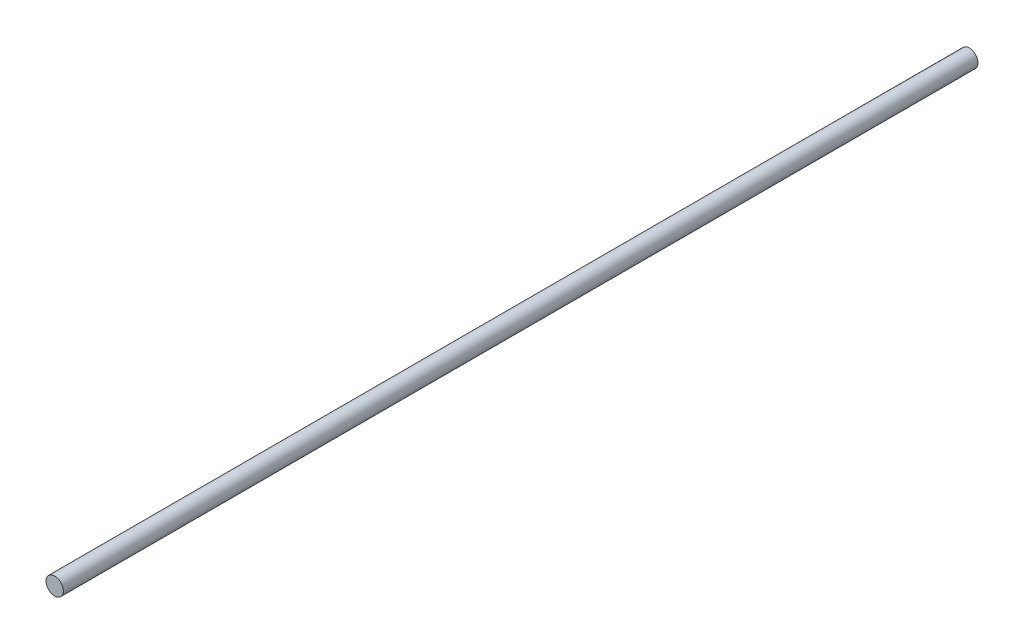
ISO-10303-21;
HEADER;
FILE_DESCRIPTION(('STEP AP214'),'2;1');
FILE_NAME('part.step','',(''),(''),'','','');
FILE_SCHEMA(('AUTOMOTIVE_DESIGN { 1 0 10303 214 1 1 1 1 }'));
ENDSEC;
DATA;
#1=APPLICATION_CONTEXT('core data for automotive mechanical design processes');
#2=APPLICATION_PROTOCOL_DEFINITION('international standard','automotive_design',2000,#1);
#3=PRODUCT_CONTEXT('',#1,'mechanical');
#4=PRODUCT('Part','Part','',(#3));
#5=PRODUCT_RELATED_PRODUCT_CATEGORY('part','',(#4));
#6=PRODUCT_DEFINITION_FORMATION('','',#4);
#7=PRODUCT_DEFINITION_CONTEXT('part definition',#1,'design');
#8=PRODUCT_DEFINITION('design','',#6,#7);
#9=PRODUCT_DEFINITION_SHAPE('','',#8);
#10=(LENGTH_UNIT() NAMED_UNIT(*) SI_UNIT(.MILLI.,.METRE.));
#11=(NAMED_UNIT(*) PLANE_ANGLE_UNIT() SI_UNIT($,.RADIAN.));
#12=(NAMED_UNIT(*) SI_UNIT($,.STERADIAN.) SOLID_ANGLE_UNIT());
#13=UNCERTAINTY_MEASURE_WITH_UNIT(LENGTH_MEASURE(1.E-05),#10,'distance_accuracy_value','');
#14=(GEOMETRIC_REPRESENTATION_CONTEXT(3) GLOBAL_UNCERTAINTY_ASSIGNED_CONTEXT((#13)) GLOBAL_UNIT_ASSIGNED_CONTEXT((#10,
#11,#12)) REPRESENTATION_CONTEXT('',''));
#15=CARTESIAN_POINT('',(0.,0.,0.));
#16=DIRECTION('',(0.,0.,1.));
#17=DIRECTION('',(1.,0.,0.));
#18=AXIS2_PLACEMENT_3D('',#15,#16,#17);
#19=CARTESIAN_POINT('',(0.,0.,500.));
#20=DIRECTION('',(0.,0.,-1.));
#21=DIRECTION('',(-1.,0.,0.));
#22=AXIS2_PLACEMENT_3D('',#19,#20,#21);
#23=CYLINDRICAL_SURFACE('',#22,4.75);
#24=CARTESIAN_POINT('',(0.,0.,500.));
#25=DIRECTION('',(0.,0.,1.));
#26=DIRECTION('',(1.,0.,0.));
#27=AXIS2_PLACEMENT_3D('',#24,#25,#26);
#28=CIRCLE('',#27,4.75);
#29=CARTESIAN_POINT('',(4.75,0.,500.));
#30=VERTEX_POINT('',#29);
#31=EDGE_CURVE('E10',#30,#30,#28,.T.);
#32=ORIENTED_EDGE('',*,*,#31,.F.);
#33=EDGE_LOOP('',(#32));
#34=FACE_BOUND('',#33,.T.);
#35=CARTESIAN_POINT('',(0.,0.,0.));
#36=DIRECTION('',(0.,0.,1.));
#37=DIRECTION('',(1.,0.,0.));
#38=AXIS2_PLACEMENT_3D('',#35,#36,#37);
#39=CIRCLE('',#38,4.75);
#40=CARTESIAN_POINT('',(4.75,0.,0.));
#41=VERTEX_POINT('',#40);
#42=EDGE_CURVE('E40',#41,#41,#39,.T.);
#43=ORIENTED_EDGE('',*,*,#42,.T.);
#44=EDGE_LOOP('',(#43));
#45=FACE_BOUND('',#44,.T.);
#46=ADVANCED_FACE('F37',(#34,#45),#23,.T.);
#47=CARTESIAN_POINT('',(0.,0.,500.));
#48=DIRECTION('',(0.,0.,1.));
#49=DIRECTION('',(1.,0.,0.));
#50=AXIS2_PLACEMENT_3D('',#47,#48,#49);
#51=PLANE('',#50);
#52=ORIENTED_EDGE('',*,*,#31,.T.);
#53=EDGE_LOOP('',(#52));
#54=FACE_BOUND('',#53,.T.);
#55=ADVANCED_FACE('F54',(#54),#51,.T.);
#56=CARTESIAN_POINT('',(0.,0.,0.));
#57=DIRECTION('',(0.,0.,1.));
#58=DIRECTION('',(1.,0.,0.));
#59=AXIS2_PLACEMENT_3D('',#56,#57,#58);
#60=PLANE('',#59);
#61=ORIENTED_EDGE('',*,*,#42,.F.);
#62=EDGE_LOOP('',(#61));
#63=FACE_BOUND('',#62,.T.);
#64=ADVANCED_FACE('F52',(#63),#60,.F.);
#65=CLOSED_SHELL('',(#46,#55,#64));
#66=MANIFOLD_SOLID_BREP('B2',#65);
#67=ADVANCED_BREP_SHAPE_REPRESENTATION('',(#18,#66),#14);
#68=SHAPE_DEFINITION_REPRESENTATION(#9,#67);
ENDSEC;
END-ISO-10303-21;
